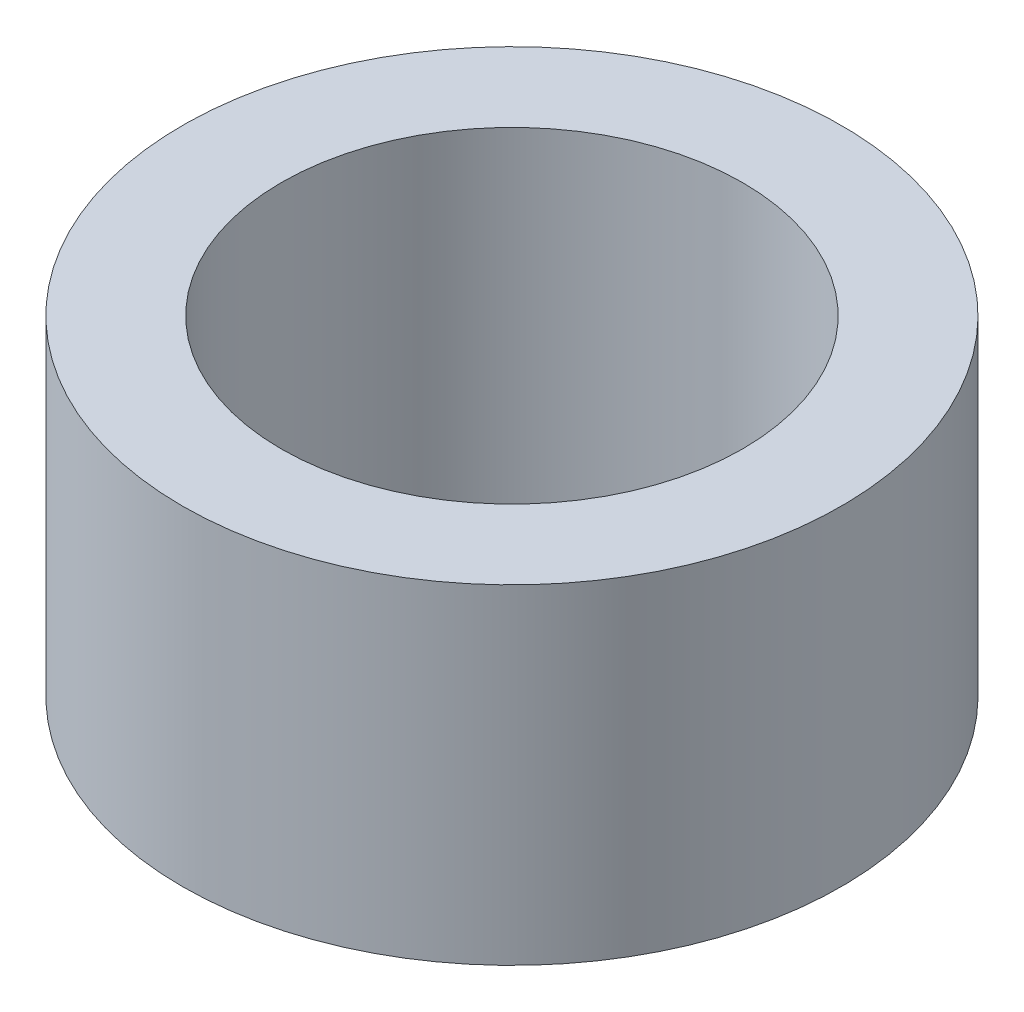
ISO-10303-21;
HEADER;
FILE_DESCRIPTION(('STEP AP214'),'2;1');
FILE_NAME('part.step','',(''),(''),'','','');
FILE_SCHEMA(('AUTOMOTIVE_DESIGN { 1 0 10303 214 1 1 1 1 }'));
ENDSEC;
DATA;
#1=APPLICATION_CONTEXT('core data for automotive mechanical design processes');
#2=APPLICATION_PROTOCOL_DEFINITION('international standard','automotive_design',2000,#1);
#3=PRODUCT_CONTEXT('',#1,'mechanical');
#4=PRODUCT('Part','Part','',(#3));
#5=PRODUCT_RELATED_PRODUCT_CATEGORY('part','',(#4));
#6=PRODUCT_DEFINITION_FORMATION('','',#4);
#7=PRODUCT_DEFINITION_CONTEXT('part definition',#1,'design');
#8=PRODUCT_DEFINITION('design','',#6,#7);
#9=PRODUCT_DEFINITION_SHAPE('','',#8);
#10=(LENGTH_UNIT() NAMED_UNIT(*) SI_UNIT(.MILLI.,.METRE.));
#11=(NAMED_UNIT(*) PLANE_ANGLE_UNIT() SI_UNIT($,.RADIAN.));
#12=(NAMED_UNIT(*) SI_UNIT($,.STERADIAN.) SOLID_ANGLE_UNIT());
#13=UNCERTAINTY_MEASURE_WITH_UNIT(LENGTH_MEASURE(1.E-05),#10,'distance_accuracy_value','');
#14=(GEOMETRIC_REPRESENTATION_CONTEXT(3) GLOBAL_UNCERTAINTY_ASSIGNED_CONTEXT((#13)) GLOBAL_UNIT_ASSIGNED_CONTEXT((#10,
#11,#12)) REPRESENTATION_CONTEXT('',''));
#15=CARTESIAN_POINT('',(0.,0.,0.));
#16=DIRECTION('',(0.,0.,1.));
#17=DIRECTION('',(1.,0.,0.));
#18=AXIS2_PLACEMENT_3D('',#15,#16,#17);
#19=CARTESIAN_POINT('',(0.,3.,0.));
#20=DIRECTION('',(0.,1.,0.));
#21=DIRECTION('',(0.,0.,1.));
#22=AXIS2_PLACEMENT_3D('',#19,#20,#21);
#23=PLANE('',#22);
#24=CARTESIAN_POINT('',(0.,3.,0.));
#25=DIRECTION('',(0.,1.,0.));
#26=DIRECTION('',(0.,0.,1.));
#27=AXIS2_PLACEMENT_3D('',#24,#25,#26);
#28=CIRCLE('',#27,3.);
#29=CARTESIAN_POINT('',(0.,3.,3.));
#30=VERTEX_POINT('',#29);
#31=EDGE_CURVE('E10',#30,#30,#28,.T.);
#32=ORIENTED_EDGE('',*,*,#31,.T.);
#33=EDGE_LOOP('',(#32));
#34=FACE_BOUND('',#33,.T.);
#35=CARTESIAN_POINT('',(0.,3.,0.));
#36=DIRECTION('',(0.,1.,0.));
#37=DIRECTION('',(0.,0.,1.));
#38=AXIS2_PLACEMENT_3D('',#35,#36,#37);
#39=CIRCLE('',#38,2.1);
#40=CARTESIAN_POINT('',(0.,3.,2.1));
#41=VERTEX_POINT('',#40);
#42=EDGE_CURVE('E43',#41,#41,#39,.T.);
#43=ORIENTED_EDGE('',*,*,#42,.F.);
#44=EDGE_LOOP('',(#43));
#45=FACE_BOUND('',#44,.T.);
#46=ADVANCED_FACE('F32',(#34,#45),#23,.T.);
#47=CARTESIAN_POINT('',(0.,0.,0.));
#48=DIRECTION('',(0.,1.,0.));
#49=DIRECTION('',(0.,0.,1.));
#50=AXIS2_PLACEMENT_3D('',#47,#48,#49);
#51=PLANE('',#50);
#52=CARTESIAN_POINT('',(0.,0.,0.));
#53=DIRECTION('',(0.,1.,0.));
#54=DIRECTION('',(0.,0.,1.));
#55=AXIS2_PLACEMENT_3D('',#52,#53,#54);
#56=CIRCLE('',#55,3.);
#57=CARTESIAN_POINT('',(0.,0.,3.));
#58=VERTEX_POINT('',#57);
#59=EDGE_CURVE('E36',#58,#58,#56,.T.);
#60=ORIENTED_EDGE('',*,*,#59,.F.);
#61=EDGE_LOOP('',(#60));
#62=FACE_BOUND('',#61,.T.);
#63=CARTESIAN_POINT('',(0.,0.,0.));
#64=DIRECTION('',(0.,1.,0.));
#65=DIRECTION('',(0.,0.,1.));
#66=AXIS2_PLACEMENT_3D('',#63,#64,#65);
#67=CIRCLE('',#66,2.1);
#68=CARTESIAN_POINT('',(0.,0.,2.1));
#69=VERTEX_POINT('',#68);
#70=EDGE_CURVE('E45',#69,#69,#67,.T.);
#71=ORIENTED_EDGE('',*,*,#70,.T.);
#72=EDGE_LOOP('',(#71));
#73=FACE_BOUND('',#72,.T.);
#74=ADVANCED_FACE('F55',(#62,#73),#51,.F.);
#75=CARTESIAN_POINT('',(0.,3.,0.));
#76=DIRECTION('',(0.,-1.,0.));
#77=DIRECTION('',(0.,0.,-1.));
#78=AXIS2_PLACEMENT_3D('',#75,#76,#77);
#79=CYLINDRICAL_SURFACE('',#78,3.);
#80=ORIENTED_EDGE('',*,*,#31,.F.);
#81=EDGE_LOOP('',(#80));
#82=FACE_BOUND('',#81,.T.);
#83=ORIENTED_EDGE('',*,*,#59,.T.);
#84=EDGE_LOOP('',(#83));
#85=FACE_BOUND('',#84,.T.);
#86=ADVANCED_FACE('F34',(#82,#85),#79,.T.);
#87=CARTESIAN_POINT('',(0.,3.,0.));
#88=DIRECTION('',(0.,-1.,0.));
#89=DIRECTION('',(0.,0.,-1.));
#90=AXIS2_PLACEMENT_3D('',#87,#88,#89);
#91=CYLINDRICAL_SURFACE('',#90,2.1);
#92=ORIENTED_EDGE('',*,*,#42,.T.);
#93=EDGE_LOOP('',(#92));
#94=FACE_BOUND('',#93,.T.);
#95=ORIENTED_EDGE('',*,*,#70,.F.);
#96=EDGE_LOOP('',(#95));
#97=FACE_BOUND('',#96,.T.);
#98=ADVANCED_FACE('F51',(#94,#97),#91,.F.);
#99=CLOSED_SHELL('',(#46,#74,#86,#98));
#100=MANIFOLD_SOLID_BREP('B2',#99);
#101=ADVANCED_BREP_SHAPE_REPRESENTATION('',(#18,#100),#14);
#102=SHAPE_DEFINITION_REPRESENTATION(#9,#101);
ENDSEC;
END-ISO-10303-21;
